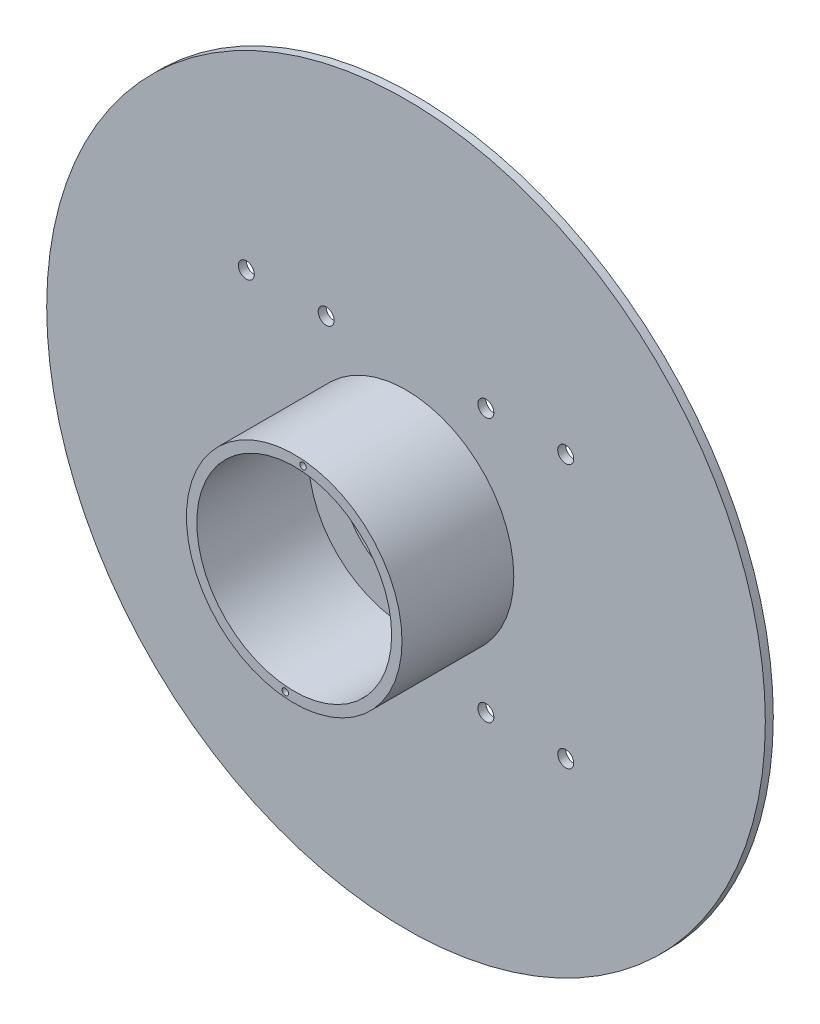
ISO-10303-21;
HEADER;
FILE_DESCRIPTION(('STEP AP214'),'2;1');
FILE_NAME('part.step','',(''),(''),'','','');
FILE_SCHEMA(('AUTOMOTIVE_DESIGN { 1 0 10303 214 1 1 1 1 }'));
ENDSEC;
DATA;
#1=APPLICATION_CONTEXT('core data for automotive mechanical design processes');
#2=APPLICATION_PROTOCOL_DEFINITION('international standard','automotive_design',2000,#1);
#3=PRODUCT_CONTEXT('',#1,'mechanical');
#4=PRODUCT('Part','Part','',(#3));
#5=PRODUCT_RELATED_PRODUCT_CATEGORY('part','',(#4));
#6=PRODUCT_DEFINITION_FORMATION('','',#4);
#7=PRODUCT_DEFINITION_CONTEXT('part definition',#1,'design');
#8=PRODUCT_DEFINITION('design','',#6,#7);
#9=PRODUCT_DEFINITION_SHAPE('','',#8);
#10=(LENGTH_UNIT() NAMED_UNIT(*) SI_UNIT(.MILLI.,.METRE.));
#11=(NAMED_UNIT(*) PLANE_ANGLE_UNIT() SI_UNIT($,.RADIAN.));
#12=(NAMED_UNIT(*) SI_UNIT($,.STERADIAN.) SOLID_ANGLE_UNIT());
#13=UNCERTAINTY_MEASURE_WITH_UNIT(LENGTH_MEASURE(1.E-05),#10,'distance_accuracy_value','');
#14=(GEOMETRIC_REPRESENTATION_CONTEXT(3) GLOBAL_UNCERTAINTY_ASSIGNED_CONTEXT((#13)) GLOBAL_UNIT_ASSIGNED_CONTEXT((#10,
#11,#12)) REPRESENTATION_CONTEXT('',''));
#15=CARTESIAN_POINT('',(0.,0.,0.));
#16=DIRECTION('',(0.,0.,1.));
#17=DIRECTION('',(1.,0.,0.));
#18=AXIS2_PLACEMENT_3D('',#15,#16,#17);
#19=CARTESIAN_POINT('',(0.,0.,1.));
#20=DIRECTION('',(0.,0.,-1.));
#21=DIRECTION('',(-1.,0.,0.));
#22=AXIS2_PLACEMENT_3D('',#19,#20,#21);
#23=CYLINDRICAL_SURFACE('',#22,45.);
#24=CARTESIAN_POINT('',(0.,0.,1.));
#25=DIRECTION('',(0.,0.,1.));
#26=DIRECTION('',(1.,0.,0.));
#27=AXIS2_PLACEMENT_3D('',#24,#25,#26);
#28=CIRCLE('',#27,45.);
#29=CARTESIAN_POINT('',(45.,0.,1.));
#30=VERTEX_POINT('',#29);
#31=EDGE_CURVE('E51',#30,#30,#28,.T.);
#32=ORIENTED_EDGE('',*,*,#31,.F.);
#33=EDGE_LOOP('',(#32));
#34=FACE_BOUND('',#33,.T.);
#35=CARTESIAN_POINT('',(0.,0.,0.));
#36=DIRECTION('',(0.,0.,1.));
#37=DIRECTION('',(1.,0.,0.));
#38=AXIS2_PLACEMENT_3D('',#35,#36,#37);
#39=CIRCLE('',#38,45.);
#40=CARTESIAN_POINT('',(45.,0.,0.));
#41=VERTEX_POINT('',#40);
#42=EDGE_CURVE('E55',#41,#41,#39,.T.);
#43=ORIENTED_EDGE('',*,*,#42,.T.);
#44=EDGE_LOOP('',(#43));
#45=FACE_BOUND('',#44,.T.);
#46=ADVANCED_FACE('F45',(#34,#45),#23,.T.);
#47=CARTESIAN_POINT('',(0.,0.,1.));
#48=DIRECTION('',(0.,0.,1.));
#49=DIRECTION('',(1.,0.,0.));
#50=AXIS2_PLACEMENT_3D('',#47,#48,#49);
#51=PLANE('',#50);
#52=CARTESIAN_POINT('',(0.,0.,1.));
#53=DIRECTION('',(0.,0.,1.));
#54=DIRECTION('',(1.,0.,0.));
#55=AXIS2_PLACEMENT_3D('',#52,#53,#54);
#56=CIRCLE('',#55,13.5);
#57=CARTESIAN_POINT('',(13.5,0.,1.));
#58=VERTEX_POINT('',#57);
#59=EDGE_CURVE('E96',#58,#58,#56,.T.);
#60=ORIENTED_EDGE('',*,*,#59,.F.);
#61=EDGE_LOOP('',(#60));
#62=FACE_BOUND('',#61,.T.);
#63=CARTESIAN_POINT('',(20.,16.5,1.));
#64=DIRECTION('',(0.,0.,1.));
#65=DIRECTION('',(1.,0.,0.));
#66=AXIS2_PLACEMENT_3D('',#63,#64,#65);
#67=CIRCLE('',#66,1.);
#68=CARTESIAN_POINT('',(21.,16.5,1.));
#69=VERTEX_POINT('',#68);
#70=EDGE_CURVE('E87',#69,#69,#67,.T.);
#71=ORIENTED_EDGE('',*,*,#70,.F.);
#72=EDGE_LOOP('',(#71));
#73=FACE_BOUND('',#72,.T.);
#74=CARTESIAN_POINT('',(-20.,16.5,1.));
#75=DIRECTION('',(0.,0.,1.));
#76=DIRECTION('',(1.,0.,0.));
#77=AXIS2_PLACEMENT_3D('',#74,#75,#76);
#78=CIRCLE('',#77,1.);
#79=CARTESIAN_POINT('',(-19.,16.5,1.));
#80=VERTEX_POINT('',#79);
#81=EDGE_CURVE('E81',#80,#80,#78,.T.);
#82=ORIENTED_EDGE('',*,*,#81,.F.);
#83=EDGE_LOOP('',(#82));
#84=FACE_BOUND('',#83,.T.);
#85=CARTESIAN_POINT('',(-20.,-16.5,1.));
#86=DIRECTION('',(0.,0.,1.));
#87=DIRECTION('',(1.,0.,0.));
#88=AXIS2_PLACEMENT_3D('',#85,#86,#87);
#89=CIRCLE('',#88,1.);
#90=CARTESIAN_POINT('',(-19.,-16.5,1.));
#91=VERTEX_POINT('',#90);
#92=EDGE_CURVE('E75',#91,#91,#89,.T.);
#93=ORIENTED_EDGE('',*,*,#92,.F.);
#94=EDGE_LOOP('',(#93));
#95=FACE_BOUND('',#94,.T.);
#96=CARTESIAN_POINT('',(10.,-16.5,1.));
#97=DIRECTION('',(0.,0.,1.));
#98=DIRECTION('',(1.,0.,0.));
#99=AXIS2_PLACEMENT_3D('',#96,#97,#98);
#100=CIRCLE('',#99,1.);
#101=CARTESIAN_POINT('',(11.,-16.5,1.));
#102=VERTEX_POINT('',#101);
#103=EDGE_CURVE('E68',#102,#102,#100,.T.);
#104=ORIENTED_EDGE('',*,*,#103,.F.);
#105=EDGE_LOOP('',(#104));
#106=FACE_BOUND('',#105,.T.);
#107=CARTESIAN_POINT('',(10.,16.5,1.));
#108=DIRECTION('',(0.,0.,1.));
#109=DIRECTION('',(1.,0.,0.));
#110=AXIS2_PLACEMENT_3D('',#107,#108,#109);
#111=CIRCLE('',#110,1.);
#112=CARTESIAN_POINT('',(11.,16.5,1.));
#113=VERTEX_POINT('',#112);
#114=EDGE_CURVE('E105',#113,#113,#111,.T.);
#115=ORIENTED_EDGE('',*,*,#114,.F.);
#116=EDGE_LOOP('',(#115));
#117=FACE_BOUND('',#116,.T.);
#118=CARTESIAN_POINT('',(-10.,16.5,1.));
#119=DIRECTION('',(0.,0.,1.));
#120=DIRECTION('',(1.,0.,0.));
#121=AXIS2_PLACEMENT_3D('',#118,#119,#120);
#122=CIRCLE('',#121,1.);
#123=CARTESIAN_POINT('',(-8.99999999999999,16.5,1.));
#124=VERTEX_POINT('',#123);
#125=EDGE_CURVE('E99',#124,#124,#122,.T.);
#126=ORIENTED_EDGE('',*,*,#125,.F.);
#127=EDGE_LOOP('',(#126));
#128=FACE_BOUND('',#127,.T.);
#129=CARTESIAN_POINT('',(-9.99999999999999,-16.5,1.));
#130=DIRECTION('',(0.,0.,1.));
#131=DIRECTION('',(1.,0.,0.));
#132=AXIS2_PLACEMENT_3D('',#129,#130,#131);
#133=CIRCLE('',#132,1.);
#134=CARTESIAN_POINT('',(-8.99999999999999,-16.5,1.));
#135=VERTEX_POINT('',#134);
#136=EDGE_CURVE('E92',#135,#135,#133,.T.);
#137=ORIENTED_EDGE('',*,*,#136,.F.);
#138=EDGE_LOOP('',(#137));
#139=FACE_BOUND('',#138,.T.);
#140=CARTESIAN_POINT('',(20.,-16.5,1.));
#141=DIRECTION('',(0.,0.,1.));
#142=DIRECTION('',(1.,0.,0.));
#143=AXIS2_PLACEMENT_3D('',#140,#141,#142);
#144=CIRCLE('',#143,1.);
#145=CARTESIAN_POINT('',(21.,-16.5,1.));
#146=VERTEX_POINT('',#145);
#147=EDGE_CURVE('E62',#146,#146,#144,.T.);
#148=ORIENTED_EDGE('',*,*,#147,.F.);
#149=EDGE_LOOP('',(#148));
#150=FACE_BOUND('',#149,.T.);
#151=ORIENTED_EDGE('',*,*,#31,.T.);
#152=EDGE_LOOP('',(#151));
#153=FACE_BOUND('',#152,.T.);
#154=ADVANCED_FACE('F170',(#62,#73,#84,#95,#106,#117,#128,#139,#150,#153),#51,.T.);
#155=CARTESIAN_POINT('',(0.,0.,0.));
#156=DIRECTION('',(0.,0.,1.));
#157=DIRECTION('',(1.,0.,0.));
#158=AXIS2_PLACEMENT_3D('',#155,#156,#157);
#159=PLANE('',#158);
#160=CARTESIAN_POINT('',(0.,0.,0.));
#161=DIRECTION('',(0.,0.,1.));
#162=DIRECTION('',(1.,0.,0.));
#163=AXIS2_PLACEMENT_3D('',#160,#161,#162);
#164=CIRCLE('',#163,8.);
#165=CARTESIAN_POINT('',(8.,0.,0.));
#166=VERTEX_POINT('',#165);
#167=EDGE_CURVE('E112',#166,#166,#164,.T.);
#168=ORIENTED_EDGE('',*,*,#167,.T.);
#169=EDGE_LOOP('',(#168));
#170=FACE_BOUND('',#169,.T.);
#171=CARTESIAN_POINT('',(20.,16.5,0.));
#172=DIRECTION('',(0.,0.,1.));
#173=DIRECTION('',(1.,0.,0.));
#174=AXIS2_PLACEMENT_3D('',#171,#172,#173);
#175=CIRCLE('',#174,1.);
#176=CARTESIAN_POINT('',(21.,16.5,0.));
#177=VERTEX_POINT('',#176);
#178=EDGE_CURVE('E65',#177,#177,#175,.T.);
#179=ORIENTED_EDGE('',*,*,#178,.T.);
#180=EDGE_LOOP('',(#179));
#181=FACE_BOUND('',#180,.T.);
#182=CARTESIAN_POINT('',(-20.,16.5,0.));
#183=DIRECTION('',(0.,0.,1.));
#184=DIRECTION('',(1.,0.,0.));
#185=AXIS2_PLACEMENT_3D('',#182,#183,#184);
#186=CIRCLE('',#185,1.);
#187=CARTESIAN_POINT('',(-19.,16.5,0.));
#188=VERTEX_POINT('',#187);
#189=EDGE_CURVE('E84',#188,#188,#186,.T.);
#190=ORIENTED_EDGE('',*,*,#189,.T.);
#191=EDGE_LOOP('',(#190));
#192=FACE_BOUND('',#191,.T.);
#193=CARTESIAN_POINT('',(-20.,-16.5,0.));
#194=DIRECTION('',(0.,0.,1.));
#195=DIRECTION('',(1.,0.,0.));
#196=AXIS2_PLACEMENT_3D('',#193,#194,#195);
#197=CIRCLE('',#196,1.);
#198=CARTESIAN_POINT('',(-19.,-16.5,0.));
#199=VERTEX_POINT('',#198);
#200=EDGE_CURVE('E78',#199,#199,#197,.T.);
#201=ORIENTED_EDGE('',*,*,#200,.T.);
#202=EDGE_LOOP('',(#201));
#203=FACE_BOUND('',#202,.T.);
#204=CARTESIAN_POINT('',(10.,-16.5,0.));
#205=DIRECTION('',(0.,0.,1.));
#206=DIRECTION('',(1.,0.,0.));
#207=AXIS2_PLACEMENT_3D('',#204,#205,#206);
#208=CIRCLE('',#207,1.);
#209=CARTESIAN_POINT('',(11.,-16.5,0.));
#210=VERTEX_POINT('',#209);
#211=EDGE_CURVE('E71',#210,#210,#208,.T.);
#212=ORIENTED_EDGE('',*,*,#211,.T.);
#213=EDGE_LOOP('',(#212));
#214=FACE_BOUND('',#213,.T.);
#215=CARTESIAN_POINT('',(10.,16.5,0.));
#216=DIRECTION('',(0.,0.,1.));
#217=DIRECTION('',(1.,0.,0.));
#218=AXIS2_PLACEMENT_3D('',#215,#216,#217);
#219=CIRCLE('',#218,1.);
#220=CARTESIAN_POINT('',(11.,16.5,0.));
#221=VERTEX_POINT('',#220);
#222=EDGE_CURVE('E72',#221,#221,#219,.T.);
#223=ORIENTED_EDGE('',*,*,#222,.T.);
#224=EDGE_LOOP('',(#223));
#225=FACE_BOUND('',#224,.T.);
#226=CARTESIAN_POINT('',(-10.,16.5,0.));
#227=DIRECTION('',(0.,0.,1.));
#228=DIRECTION('',(1.,0.,0.));
#229=AXIS2_PLACEMENT_3D('',#226,#227,#228);
#230=CIRCLE('',#229,1.);
#231=CARTESIAN_POINT('',(-8.99999999999999,16.5,0.));
#232=VERTEX_POINT('',#231);
#233=EDGE_CURVE('E102',#232,#232,#230,.T.);
#234=ORIENTED_EDGE('',*,*,#233,.T.);
#235=EDGE_LOOP('',(#234));
#236=FACE_BOUND('',#235,.T.);
#237=CARTESIAN_POINT('',(-9.99999999999999,-16.5,0.));
#238=DIRECTION('',(0.,0.,1.));
#239=DIRECTION('',(1.,0.,0.));
#240=AXIS2_PLACEMENT_3D('',#237,#238,#239);
#241=CIRCLE('',#240,1.);
#242=CARTESIAN_POINT('',(-8.99999999999999,-16.5,0.));
#243=VERTEX_POINT('',#242);
#244=EDGE_CURVE('E95',#243,#243,#241,.T.);
#245=ORIENTED_EDGE('',*,*,#244,.T.);
#246=EDGE_LOOP('',(#245));
#247=FACE_BOUND('',#246,.T.);
#248=CARTESIAN_POINT('',(20.,-16.5,0.));
#249=DIRECTION('',(0.,0.,1.));
#250=DIRECTION('',(1.,0.,0.));
#251=AXIS2_PLACEMENT_3D('',#248,#249,#250);
#252=CIRCLE('',#251,1.);
#253=CARTESIAN_POINT('',(21.,-16.5,0.));
#254=VERTEX_POINT('',#253);
#255=EDGE_CURVE('E60',#254,#254,#252,.T.);
#256=ORIENTED_EDGE('',*,*,#255,.T.);
#257=EDGE_LOOP('',(#256));
#258=FACE_BOUND('',#257,.T.);
#259=ORIENTED_EDGE('',*,*,#42,.F.);
#260=EDGE_LOOP('',(#259));
#261=FACE_BOUND('',#260,.T.);
#262=ADVANCED_FACE('F180',(#170,#181,#192,#203,#214,#225,#236,#247,#258,#261),#159,.F.);
#263=CARTESIAN_POINT('',(20.,-16.5,0.));
#264=DIRECTION('',(0.,0.,1.));
#265=DIRECTION('',(1.,0.,0.));
#266=AXIS2_PLACEMENT_3D('',#263,#264,#265);
#267=CYLINDRICAL_SURFACE('',#266,1.);
#268=ORIENTED_EDGE('',*,*,#255,.F.);
#269=EDGE_LOOP('',(#268));
#270=FACE_BOUND('',#269,.T.);
#271=ORIENTED_EDGE('',*,*,#147,.T.);
#272=EDGE_LOOP('',(#271));
#273=FACE_BOUND('',#272,.T.);
#274=ADVANCED_FACE('F186',(#270,#273),#267,.F.);
#275=CARTESIAN_POINT('',(-9.99999999999999,-16.5,0.));
#276=DIRECTION('',(0.,0.,1.));
#277=DIRECTION('',(1.,0.,0.));
#278=AXIS2_PLACEMENT_3D('',#275,#276,#277);
#279=CYLINDRICAL_SURFACE('',#278,1.);
#280=ORIENTED_EDGE('',*,*,#244,.F.);
#281=EDGE_LOOP('',(#280));
#282=FACE_BOUND('',#281,.T.);
#283=ORIENTED_EDGE('',*,*,#136,.T.);
#284=EDGE_LOOP('',(#283));
#285=FACE_BOUND('',#284,.T.);
#286=ADVANCED_FACE('F191',(#282,#285),#279,.F.);
#287=CARTESIAN_POINT('',(-10.,16.5,0.));
#288=DIRECTION('',(0.,0.,1.));
#289=DIRECTION('',(1.,0.,0.));
#290=AXIS2_PLACEMENT_3D('',#287,#288,#289);
#291=CYLINDRICAL_SURFACE('',#290,1.);
#292=ORIENTED_EDGE('',*,*,#233,.F.);
#293=EDGE_LOOP('',(#292));
#294=FACE_BOUND('',#293,.T.);
#295=ORIENTED_EDGE('',*,*,#125,.T.);
#296=EDGE_LOOP('',(#295));
#297=FACE_BOUND('',#296,.T.);
#298=ADVANCED_FACE('F214',(#294,#297),#291,.F.);
#299=CARTESIAN_POINT('',(10.,16.5,0.));
#300=DIRECTION('',(0.,0.,1.));
#301=DIRECTION('',(1.,0.,0.));
#302=AXIS2_PLACEMENT_3D('',#299,#300,#301);
#303=CYLINDRICAL_SURFACE('',#302,1.);
#304=ORIENTED_EDGE('',*,*,#222,.F.);
#305=EDGE_LOOP('',(#304));
#306=FACE_BOUND('',#305,.T.);
#307=ORIENTED_EDGE('',*,*,#114,.T.);
#308=EDGE_LOOP('',(#307));
#309=FACE_BOUND('',#308,.T.);
#310=ADVANCED_FACE('F200',(#306,#309),#303,.F.);
#311=CARTESIAN_POINT('',(10.,-16.5,0.));
#312=DIRECTION('',(0.,0.,1.));
#313=DIRECTION('',(1.,0.,0.));
#314=AXIS2_PLACEMENT_3D('',#311,#312,#313);
#315=CYLINDRICAL_SURFACE('',#314,1.);
#316=ORIENTED_EDGE('',*,*,#211,.F.);
#317=EDGE_LOOP('',(#316));
#318=FACE_BOUND('',#317,.T.);
#319=ORIENTED_EDGE('',*,*,#103,.T.);
#320=EDGE_LOOP('',(#319));
#321=FACE_BOUND('',#320,.T.);
#322=ADVANCED_FACE('F196',(#318,#321),#315,.F.);
#323=CARTESIAN_POINT('',(-20.,-16.5,0.));
#324=DIRECTION('',(0.,0.,1.));
#325=DIRECTION('',(1.,0.,0.));
#326=AXIS2_PLACEMENT_3D('',#323,#324,#325);
#327=CYLINDRICAL_SURFACE('',#326,1.);
#328=ORIENTED_EDGE('',*,*,#200,.F.);
#329=EDGE_LOOP('',(#328));
#330=FACE_BOUND('',#329,.T.);
#331=ORIENTED_EDGE('',*,*,#92,.T.);
#332=EDGE_LOOP('',(#331));
#333=FACE_BOUND('',#332,.T.);
#334=ADVANCED_FACE('F199',(#330,#333),#327,.F.);
#335=CARTESIAN_POINT('',(-20.,16.5,0.));
#336=DIRECTION('',(0.,0.,1.));
#337=DIRECTION('',(1.,0.,0.));
#338=AXIS2_PLACEMENT_3D('',#335,#336,#337);
#339=CYLINDRICAL_SURFACE('',#338,1.);
#340=ORIENTED_EDGE('',*,*,#189,.F.);
#341=EDGE_LOOP('',(#340));
#342=FACE_BOUND('',#341,.T.);
#343=ORIENTED_EDGE('',*,*,#81,.T.);
#344=EDGE_LOOP('',(#343));
#345=FACE_BOUND('',#344,.T.);
#346=ADVANCED_FACE('F204',(#342,#345),#339,.F.);
#347=CARTESIAN_POINT('',(20.,16.5,0.));
#348=DIRECTION('',(0.,0.,1.));
#349=DIRECTION('',(1.,0.,0.));
#350=AXIS2_PLACEMENT_3D('',#347,#348,#349);
#351=CYLINDRICAL_SURFACE('',#350,1.);
#352=ORIENTED_EDGE('',*,*,#178,.F.);
#353=EDGE_LOOP('',(#352));
#354=FACE_BOUND('',#353,.T.);
#355=ORIENTED_EDGE('',*,*,#70,.T.);
#356=EDGE_LOOP('',(#355));
#357=FACE_BOUND('',#356,.T.);
#358=ADVANCED_FACE('F171',(#354,#357),#351,.F.);
#359=CARTESIAN_POINT('',(0.,0.,7.));
#360=DIRECTION('',(0.,0.,-1.));
#361=DIRECTION('',(-1.,0.,0.));
#362=AXIS2_PLACEMENT_3D('',#359,#360,#361);
#363=CYLINDRICAL_SURFACE('',#362,13.5);
#364=ORIENTED_EDGE('',*,*,#59,.T.);
#365=EDGE_LOOP('',(#364));
#366=FACE_BOUND('',#365,.T.);
#367=CARTESIAN_POINT('',(0.,0.,15.));
#368=DIRECTION('',(0.,0.,1.));
#369=DIRECTION('',(1.,0.,0.));
#370=AXIS2_PLACEMENT_3D('',#367,#368,#369);
#371=CIRCLE('',#370,13.5);
#372=CARTESIAN_POINT('',(13.5,0.,15.));
#373=VERTEX_POINT('',#372);
#374=EDGE_CURVE('E118',#373,#373,#371,.T.);
#375=ORIENTED_EDGE('',*,*,#374,.F.);
#376=EDGE_LOOP('',(#375));
#377=FACE_BOUND('',#376,.T.);
#378=ADVANCED_FACE('F161',(#366,#377),#363,.T.);
#379=CARTESIAN_POINT('',(0.,0.,7.));
#380=DIRECTION('',(0.,0.,-1.));
#381=DIRECTION('',(-1.,0.,0.));
#382=AXIS2_PLACEMENT_3D('',#379,#380,#381);
#383=CYLINDRICAL_SURFACE('',#382,12.2);
#384=CARTESIAN_POINT('',(0.,0.,1.));
#385=DIRECTION('',(0.,0.,1.));
#386=DIRECTION('',(1.,0.,0.));
#387=AXIS2_PLACEMENT_3D('',#384,#385,#386);
#388=CIRCLE('',#387,12.2);
#389=CARTESIAN_POINT('',(12.2,0.,1.));
#390=VERTEX_POINT('',#389);
#391=EDGE_CURVE('E12',#390,#390,#388,.F.);
#392=ORIENTED_EDGE('',*,*,#391,.T.);
#393=EDGE_LOOP('',(#392));
#394=FACE_BOUND('',#393,.T.);
#395=CARTESIAN_POINT('',(0.,0.,15.));
#396=DIRECTION('',(0.,0.,1.));
#397=DIRECTION('',(1.,0.,0.));
#398=AXIS2_PLACEMENT_3D('',#395,#396,#397);
#399=CIRCLE('',#398,12.2);
#400=CARTESIAN_POINT('',(12.2,0.,15.));
#401=VERTEX_POINT('',#400);
#402=EDGE_CURVE('E121',#401,#401,#399,.T.);
#403=ORIENTED_EDGE('',*,*,#402,.T.);
#404=EDGE_LOOP('',(#403));
#405=FACE_BOUND('',#404,.T.);
#406=ADVANCED_FACE('F158',(#394,#405),#383,.F.);
#407=CARTESIAN_POINT('',(0.,0.,1.));
#408=DIRECTION('',(0.,0.,1.));
#409=DIRECTION('',(1.,0.,0.));
#410=AXIS2_PLACEMENT_3D('',#407,#408,#409);
#411=CIRCLE('',#410,8.);
#412=CARTESIAN_POINT('',(8.,0.,1.));
#413=VERTEX_POINT('',#412);
#414=EDGE_CURVE('E115',#413,#413,#411,.T.);
#415=ORIENTED_EDGE('',*,*,#414,.F.);
#416=EDGE_LOOP('',(#415));
#417=FACE_BOUND('',#416,.T.);
#418=ORIENTED_EDGE('',*,*,#391,.F.);
#419=EDGE_LOOP('',(#418));
#420=FACE_BOUND('',#419,.T.);
#421=ADVANCED_FACE('F160',(#417,#420),#51,.T.);
#422=CARTESIAN_POINT('',(0.,0.,-9.));
#423=DIRECTION('',(0.,0.,1.));
#424=DIRECTION('',(1.,0.,0.));
#425=AXIS2_PLACEMENT_3D('',#422,#423,#424);
#426=CYLINDRICAL_SURFACE('',#425,8.);
#427=ORIENTED_EDGE('',*,*,#414,.T.);
#428=EDGE_LOOP('',(#427));
#429=FACE_BOUND('',#428,.T.);
#430=ORIENTED_EDGE('',*,*,#167,.F.);
#431=EDGE_LOOP('',(#430));
#432=FACE_BOUND('',#431,.T.);
#433=ADVANCED_FACE('F150',(#429,#432),#426,.F.);
#434=CARTESIAN_POINT('',(0.,0.,15.));
#435=DIRECTION('',(0.,0.,1.));
#436=DIRECTION('',(1.,0.,0.));
#437=AXIS2_PLACEMENT_3D('',#434,#435,#436);
#438=PLANE('',#437);
#439=CARTESIAN_POINT('',(1.10958553832965,12.80200452785,15.));
#440=DIRECTION('',(0.,0.,1.));
#441=DIRECTION('',(1.,0.,0.));
#442=AXIS2_PLACEMENT_3D('',#439,#440,#441);
#443=CIRCLE('',#442,0.399999999992223);
#444=CARTESIAN_POINT('',(1.50958553832188,12.80200452785,15.));
#445=VERTEX_POINT('',#444);
#446=EDGE_CURVE('E131',#445,#445,#443,.T.);
#447=ORIENTED_EDGE('',*,*,#446,.F.);
#448=EDGE_LOOP('',(#447));
#449=FACE_BOUND('',#448,.T.);
#450=CARTESIAN_POINT('',(-1.10958553833398,-12.8020045280028,15.));
#451=DIRECTION('',(0.,0.,1.));
#452=DIRECTION('',(1.,0.,0.));
#453=AXIS2_PLACEMENT_3D('',#450,#451,#452);
#454=CIRCLE('',#453,0.399999999992209);
#455=CARTESIAN_POINT('',(-0.709585538341776,-12.8020045280028,15.));
#456=VERTEX_POINT('',#455);
#457=EDGE_CURVE('E125',#456,#456,#454,.T.);
#458=ORIENTED_EDGE('',*,*,#457,.F.);
#459=EDGE_LOOP('',(#458));
#460=FACE_BOUND('',#459,.T.);
#461=ORIENTED_EDGE('',*,*,#374,.T.);
#462=EDGE_LOOP('',(#461));
#463=FACE_BOUND('',#462,.T.);
#464=ORIENTED_EDGE('',*,*,#402,.F.);
#465=EDGE_LOOP('',(#464));
#466=FACE_BOUND('',#465,.T.);
#467=ADVANCED_FACE('F146',(#449,#460,#463,#466),#438,.T.);
#468=CARTESIAN_POINT('',(-1.10958553833398,-12.8020045280028,12.2));
#469=DIRECTION('',(0.,0.,1.));
#470=DIRECTION('',(1.,0.,0.));
#471=AXIS2_PLACEMENT_3D('',#468,#469,#470);
#472=CYLINDRICAL_SURFACE('',#471,0.399999999992209);
#473=CARTESIAN_POINT('',(-1.10958553833398,-12.8020045280028,12.2));
#474=DIRECTION('',(0.,0.,1.));
#475=DIRECTION('',(1.,0.,0.));
#476=AXIS2_PLACEMENT_3D('',#473,#474,#475);
#477=CIRCLE('',#476,0.399999999992209);
#478=CARTESIAN_POINT('',(-0.709585538341776,-12.8020045280028,12.2));
#479=VERTEX_POINT('',#478);
#480=EDGE_CURVE('E128',#479,#479,#477,.T.);
#481=ORIENTED_EDGE('',*,*,#480,.F.);
#482=EDGE_LOOP('',(#481));
#483=FACE_BOUND('',#482,.T.);
#484=ORIENTED_EDGE('',*,*,#457,.T.);
#485=EDGE_LOOP('',(#484));
#486=FACE_BOUND('',#485,.T.);
#487=ADVANCED_FACE('F149',(#483,#486),#472,.F.);
#488=CARTESIAN_POINT('',(-1.10958553833398,-12.8020045280028,12.2));
#489=DIRECTION('',(0.,0.,1.));
#490=DIRECTION('',(1.,0.,0.));
#491=AXIS2_PLACEMENT_3D('',#488,#489,#490);
#492=PLANE('',#491);
#493=ORIENTED_EDGE('',*,*,#480,.T.);
#494=EDGE_LOOP('',(#493));
#495=FACE_BOUND('',#494,.T.);
#496=ADVANCED_FACE('F142',(#495),#492,.T.);
#497=CARTESIAN_POINT('',(1.10958553832965,12.80200452785,12.2));
#498=DIRECTION('',(0.,0.,1.));
#499=DIRECTION('',(1.,0.,0.));
#500=AXIS2_PLACEMENT_3D('',#497,#498,#499);
#501=CYLINDRICAL_SURFACE('',#500,0.399999999992223);
#502=CARTESIAN_POINT('',(1.10958553832965,12.80200452785,12.2));
#503=DIRECTION('',(0.,0.,1.));
#504=DIRECTION('',(1.,0.,0.));
#505=AXIS2_PLACEMENT_3D('',#502,#503,#504);
#506=CIRCLE('',#505,0.399999999992223);
#507=CARTESIAN_POINT('',(1.50958553832188,12.80200452785,12.2));
#508=VERTEX_POINT('',#507);
#509=EDGE_CURVE('E124',#508,#508,#506,.T.);
#510=ORIENTED_EDGE('',*,*,#509,.F.);
#511=EDGE_LOOP('',(#510));
#512=FACE_BOUND('',#511,.T.);
#513=ORIENTED_EDGE('',*,*,#446,.T.);
#514=EDGE_LOOP('',(#513));
#515=FACE_BOUND('',#514,.T.);
#516=ADVANCED_FACE('F139',(#512,#515),#501,.F.);
#517=CARTESIAN_POINT('',(1.10958553832965,12.80200452785,12.2));
#518=DIRECTION('',(0.,0.,1.));
#519=DIRECTION('',(1.,0.,0.));
#520=AXIS2_PLACEMENT_3D('',#517,#518,#519);
#521=PLANE('',#520);
#522=ORIENTED_EDGE('',*,*,#509,.T.);
#523=EDGE_LOOP('',(#522));
#524=FACE_BOUND('',#523,.T.);
#525=ADVANCED_FACE('F137',(#524),#521,.T.);
#526=CLOSED_SHELL('',(#46,#154,#262,#274,#286,#298,#310,#322,#334,#346,#358,#378,#406,#421,#433,
#467,#487,#496,#516,#525));
#527=MANIFOLD_SOLID_BREP('B2',#526);
#528=ADVANCED_BREP_SHAPE_REPRESENTATION('',(#18,#527),#14);
#529=SHAPE_DEFINITION_REPRESENTATION(#9,#528);
ENDSEC;
END-ISO-10303-21;
